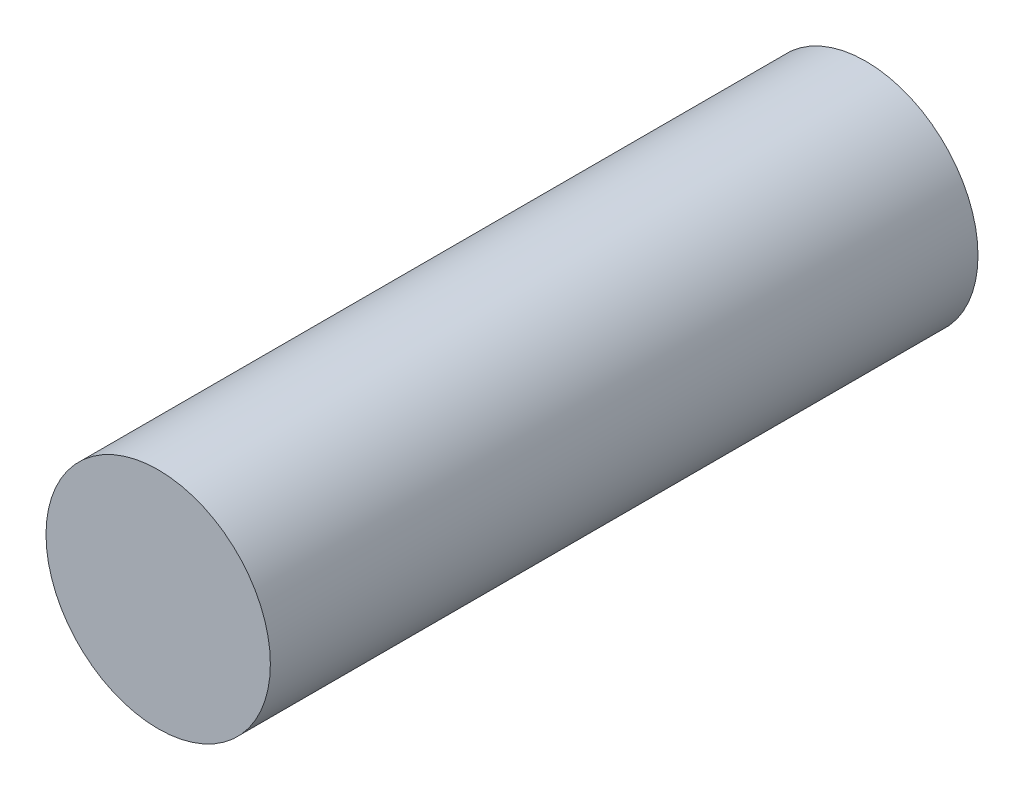
ISO-10303-21;
HEADER;
FILE_DESCRIPTION(('STEP AP214'),'2;1');
FILE_NAME('part.step','',(''),(''),'','','');
FILE_SCHEMA(('AUTOMOTIVE_DESIGN { 1 0 10303 214 1 1 1 1 }'));
ENDSEC;
DATA;
#1=APPLICATION_CONTEXT('core data for automotive mechanical design processes');
#2=APPLICATION_PROTOCOL_DEFINITION('international standard','automotive_design',2000,#1);
#3=PRODUCT_CONTEXT('',#1,'mechanical');
#4=PRODUCT('Part','Part','',(#3));
#5=PRODUCT_RELATED_PRODUCT_CATEGORY('part','',(#4));
#6=PRODUCT_DEFINITION_FORMATION('','',#4);
#7=PRODUCT_DEFINITION_CONTEXT('part definition',#1,'design');
#8=PRODUCT_DEFINITION('design','',#6,#7);
#9=PRODUCT_DEFINITION_SHAPE('','',#8);
#10=(LENGTH_UNIT() NAMED_UNIT(*) SI_UNIT(.MILLI.,.METRE.));
#11=(NAMED_UNIT(*) PLANE_ANGLE_UNIT() SI_UNIT($,.RADIAN.));
#12=(NAMED_UNIT(*) SI_UNIT($,.STERADIAN.) SOLID_ANGLE_UNIT());
#13=UNCERTAINTY_MEASURE_WITH_UNIT(LENGTH_MEASURE(1.E-05),#10,'distance_accuracy_value','');
#14=(GEOMETRIC_REPRESENTATION_CONTEXT(3) GLOBAL_UNCERTAINTY_ASSIGNED_CONTEXT((#13)) GLOBAL_UNIT_ASSIGNED_CONTEXT((#10,
#11,#12)) REPRESENTATION_CONTEXT('',''));
#15=CARTESIAN_POINT('',(0.,0.,0.));
#16=DIRECTION('',(0.,0.,1.));
#17=DIRECTION('',(1.,0.,0.));
#18=AXIS2_PLACEMENT_3D('',#15,#16,#17);
#19=CARTESIAN_POINT('',(0.,0.,-20.5));
#20=DIRECTION('',(0.,0.,1.));
#21=DIRECTION('',(1.,0.,0.));
#22=AXIS2_PLACEMENT_3D('',#19,#20,#21);
#23=CYLINDRICAL_SURFACE('',#22,6.5);
#24=CARTESIAN_POINT('',(0.,0.,-20.5));
#25=DIRECTION('',(0.,0.,1.));
#26=DIRECTION('',(1.,0.,0.));
#27=AXIS2_PLACEMENT_3D('',#24,#25,#26);
#28=CIRCLE('',#27,6.5);
#29=CARTESIAN_POINT('',(6.5,0.,-20.5));
#30=VERTEX_POINT('',#29);
#31=EDGE_CURVE('E10',#30,#30,#28,.T.);
#32=ORIENTED_EDGE('',*,*,#31,.T.);
#33=EDGE_LOOP('',(#32));
#34=FACE_BOUND('',#33,.T.);
#35=CARTESIAN_POINT('',(0.,0.,20.5));
#36=DIRECTION('',(0.,0.,1.));
#37=DIRECTION('',(1.,0.,0.));
#38=AXIS2_PLACEMENT_3D('',#35,#36,#37);
#39=CIRCLE('',#38,6.5);
#40=CARTESIAN_POINT('',(6.5,0.,20.5));
#41=VERTEX_POINT('',#40);
#42=EDGE_CURVE('E32',#41,#41,#39,.T.);
#43=ORIENTED_EDGE('',*,*,#42,.F.);
#44=EDGE_LOOP('',(#43));
#45=FACE_BOUND('',#44,.T.);
#46=ADVANCED_FACE('F29',(#34,#45),#23,.T.);
#47=CARTESIAN_POINT('',(0.,0.,-20.5));
#48=DIRECTION('',(0.,0.,1.));
#49=DIRECTION('',(1.,0.,0.));
#50=AXIS2_PLACEMENT_3D('',#47,#48,#49);
#51=PLANE('',#50);
#52=ORIENTED_EDGE('',*,*,#31,.F.);
#53=EDGE_LOOP('',(#52));
#54=FACE_BOUND('',#53,.T.);
#55=ADVANCED_FACE('F44',(#54),#51,.F.);
#56=CARTESIAN_POINT('',(0.,0.,20.5));
#57=DIRECTION('',(0.,0.,1.));
#58=DIRECTION('',(1.,0.,0.));
#59=AXIS2_PLACEMENT_3D('',#56,#57,#58);
#60=PLANE('',#59);
#61=ORIENTED_EDGE('',*,*,#42,.T.);
#62=EDGE_LOOP('',(#61));
#63=FACE_BOUND('',#62,.T.);
#64=ADVANCED_FACE('F41',(#63),#60,.T.);
#65=CLOSED_SHELL('',(#46,#55,#64));
#66=MANIFOLD_SOLID_BREP('B2',#65);
#67=ADVANCED_BREP_SHAPE_REPRESENTATION('',(#18,#66),#14);
#68=SHAPE_DEFINITION_REPRESENTATION(#9,#67);
ENDSEC;
END-ISO-10303-21;
